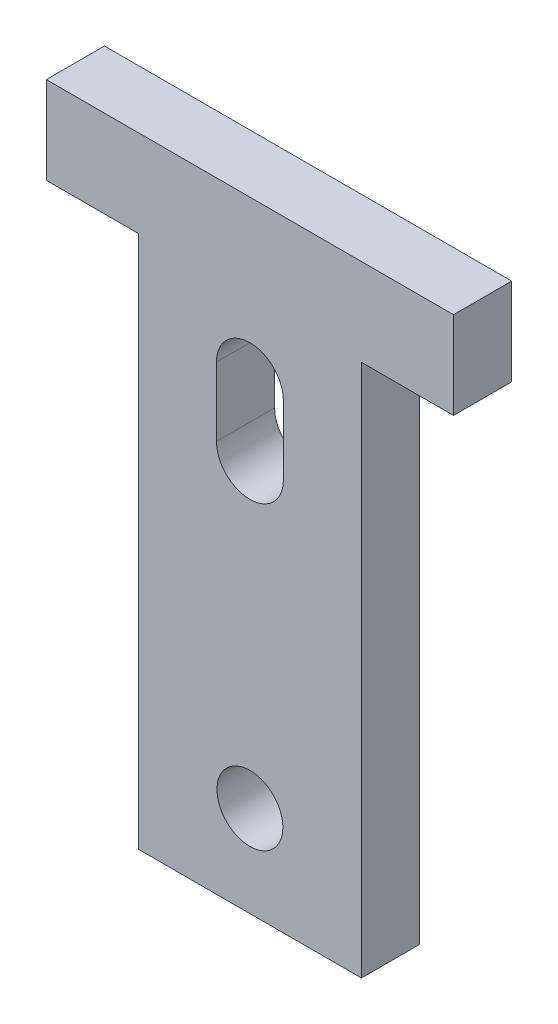
ISO-10303-21;
HEADER;
FILE_DESCRIPTION(('STEP AP214'),'2;1');
FILE_NAME('part.step','',(''),(''),'','','');
FILE_SCHEMA(('AUTOMOTIVE_DESIGN { 1 0 10303 214 1 1 1 1 }'));
ENDSEC;
DATA;
#1=APPLICATION_CONTEXT('core data for automotive mechanical design processes');
#2=APPLICATION_PROTOCOL_DEFINITION('international standard','automotive_design',2000,#1);
#3=PRODUCT_CONTEXT('',#1,'mechanical');
#4=PRODUCT('Part','Part','',(#3));
#5=PRODUCT_RELATED_PRODUCT_CATEGORY('part','',(#4));
#6=PRODUCT_DEFINITION_FORMATION('','',#4);
#7=PRODUCT_DEFINITION_CONTEXT('part definition',#1,'design');
#8=PRODUCT_DEFINITION('design','',#6,#7);
#9=PRODUCT_DEFINITION_SHAPE('','',#8);
#10=(LENGTH_UNIT() NAMED_UNIT(*) SI_UNIT(.MILLI.,.METRE.));
#11=(NAMED_UNIT(*) PLANE_ANGLE_UNIT() SI_UNIT($,.RADIAN.));
#12=(NAMED_UNIT(*) SI_UNIT($,.STERADIAN.) SOLID_ANGLE_UNIT());
#13=UNCERTAINTY_MEASURE_WITH_UNIT(LENGTH_MEASURE(1.E-05),#10,'distance_accuracy_value','');
#14=(GEOMETRIC_REPRESENTATION_CONTEXT(3) GLOBAL_UNCERTAINTY_ASSIGNED_CONTEXT((#13)) GLOBAL_UNIT_ASSIGNED_CONTEXT((#10,
#11,#12)) REPRESENTATION_CONTEXT('',''));
#15=CARTESIAN_POINT('',(0.,0.,0.));
#16=DIRECTION('',(0.,0.,1.));
#17=DIRECTION('',(1.,0.,0.));
#18=AXIS2_PLACEMENT_3D('',#15,#16,#17);
#19=CARTESIAN_POINT('',(-5.75000000000001,16.3534957789841,3.));
#20=DIRECTION('',(1.,0.,0.));
#21=DIRECTION('',(0.,1.,0.));
#22=AXIS2_PLACEMENT_3D('',#19,#20,#21);
#23=PLANE('',#22);
#24=DIRECTION('',(0.,-1.,0.));
#25=VECTOR('',#24,1.);
#26=CARTESIAN_POINT('',(-5.75000000000001,16.3534957789841,0.));
#27=LINE('',#26,#25);
#28=CARTESIAN_POINT('',(-5.75000000000001,16.3534957789841,0.));
#29=VERTEX_POINT('',#28);
#30=CARTESIAN_POINT('',(-5.75,-11.1465042210159,0.));
#31=VERTEX_POINT('',#30);
#32=EDGE_CURVE('E156',#29,#31,#27,.T.);
#33=ORIENTED_EDGE('',*,*,#32,.T.);
#34=DIRECTION('',(0.,0.,-1.));
#35=VECTOR('',#34,1.);
#36=CARTESIAN_POINT('',(-5.75,-11.1465042210159,3.));
#37=LINE('',#36,#35);
#38=CARTESIAN_POINT('',(-5.75,-11.1465042210159,3.));
#39=VERTEX_POINT('',#38);
#40=EDGE_CURVE('E11',#39,#31,#37,.T.);
#41=ORIENTED_EDGE('',*,*,#40,.F.);
#42=DIRECTION('',(0.,-1.,0.));
#43=VECTOR('',#42,1.);
#44=CARTESIAN_POINT('',(-5.75000000000001,16.3534957789841,3.));
#45=LINE('',#44,#43);
#46=CARTESIAN_POINT('',(-5.75000000000001,16.3534957789841,3.));
#47=VERTEX_POINT('',#46);
#48=EDGE_CURVE('E165',#47,#39,#45,.T.);
#49=ORIENTED_EDGE('',*,*,#48,.F.);
#50=DIRECTION('',(0.,0.,-1.));
#51=VECTOR('',#50,1.);
#52=CARTESIAN_POINT('',(-5.75000000000001,16.3534957789841,3.));
#53=LINE('',#52,#51);
#54=EDGE_CURVE('E186',#47,#29,#53,.T.);
#55=ORIENTED_EDGE('',*,*,#54,.T.);
#56=EDGE_LOOP('',(#33,#41,#49,#55));
#57=FACE_BOUND('',#56,.T.);
#58=ADVANCED_FACE('F34',(#57),#23,.F.);
#59=CARTESIAN_POINT('',(-5.75,-11.1465042210159,3.));
#60=DIRECTION('',(0.,1.,0.));
#61=DIRECTION('',(-1.,0.,0.));
#62=AXIS2_PLACEMENT_3D('',#59,#60,#61);
#63=PLANE('',#62);
#64=DIRECTION('',(1.,0.,0.));
#65=VECTOR('',#64,1.);
#66=CARTESIAN_POINT('',(-5.75,-11.1465042210159,0.));
#67=LINE('',#66,#65);
#68=CARTESIAN_POINT('',(5.75,-11.1465042210159,0.));
#69=VERTEX_POINT('',#68);
#70=EDGE_CURVE('E189',#31,#69,#67,.T.);
#71=ORIENTED_EDGE('',*,*,#70,.T.);
#72=DIRECTION('',(0.,0.,-1.));
#73=VECTOR('',#72,1.);
#74=CARTESIAN_POINT('',(5.75,-11.1465042210159,3.));
#75=LINE('',#74,#73);
#76=CARTESIAN_POINT('',(5.75,-11.1465042210159,3.));
#77=VERTEX_POINT('',#76);
#78=EDGE_CURVE('E41',#77,#69,#75,.T.);
#79=ORIENTED_EDGE('',*,*,#78,.F.);
#80=DIRECTION('',(1.,0.,0.));
#81=VECTOR('',#80,1.);
#82=CARTESIAN_POINT('',(-5.75,-11.1465042210159,3.));
#83=LINE('',#82,#81);
#84=EDGE_CURVE('E168',#39,#77,#83,.T.);
#85=ORIENTED_EDGE('',*,*,#84,.F.);
#86=ORIENTED_EDGE('',*,*,#40,.T.);
#87=EDGE_LOOP('',(#71,#79,#85,#86));
#88=FACE_BOUND('',#87,.T.);
#89=ADVANCED_FACE('F225',(#88),#63,.F.);
#90=CARTESIAN_POINT('',(5.75000000000001,16.3534957789841,3.));
#91=DIRECTION('',(1.,0.,0.));
#92=DIRECTION('',(0.,1.,0.));
#93=AXIS2_PLACEMENT_3D('',#90,#91,#92);
#94=PLANE('',#93);
#95=DIRECTION('',(0.,-1.,0.));
#96=VECTOR('',#95,1.);
#97=CARTESIAN_POINT('',(5.75000000000001,16.3534957789841,0.));
#98=LINE('',#97,#96);
#99=CARTESIAN_POINT('',(5.75000000000001,16.3534957789841,0.));
#100=VERTEX_POINT('',#99);
#101=EDGE_CURVE('E192',#100,#69,#98,.T.);
#102=ORIENTED_EDGE('',*,*,#101,.F.);
#103=DIRECTION('',(0.,0.,-1.));
#104=VECTOR('',#103,1.);
#105=CARTESIAN_POINT('',(5.75000000000001,16.3534957789841,3.));
#106=LINE('',#105,#104);
#107=CARTESIAN_POINT('',(5.75000000000001,16.3534957789841,3.));
#108=VERTEX_POINT('',#107);
#109=EDGE_CURVE('E218',#108,#100,#106,.T.);
#110=ORIENTED_EDGE('',*,*,#109,.F.);
#111=DIRECTION('',(0.,-1.,0.));
#112=VECTOR('',#111,1.);
#113=CARTESIAN_POINT('',(5.75000000000001,16.3534957789841,3.));
#114=LINE('',#113,#112);
#115=EDGE_CURVE('E171',#108,#77,#114,.T.);
#116=ORIENTED_EDGE('',*,*,#115,.T.);
#117=ORIENTED_EDGE('',*,*,#78,.T.);
#118=EDGE_LOOP('',(#102,#110,#116,#117));
#119=FACE_BOUND('',#118,.T.);
#120=ADVANCED_FACE('F222',(#119),#94,.T.);
#121=CARTESIAN_POINT('',(10.5,16.3534957789841,3.));
#122=DIRECTION('',(0.,-1.,0.));
#123=DIRECTION('',(0.,0.,-1.));
#124=AXIS2_PLACEMENT_3D('',#121,#122,#123);
#125=PLANE('',#124);
#126=DIRECTION('',(-1.,0.,0.));
#127=VECTOR('',#126,1.);
#128=CARTESIAN_POINT('',(10.5,16.3534957789841,0.));
#129=LINE('',#128,#127);
#130=CARTESIAN_POINT('',(10.5,16.3534957789841,0.));
#131=VERTEX_POINT('',#130);
#132=EDGE_CURVE('E195',#131,#100,#129,.T.);
#133=ORIENTED_EDGE('',*,*,#132,.F.);
#134=DIRECTION('',(0.,0.,-1.));
#135=VECTOR('',#134,1.);
#136=CARTESIAN_POINT('',(10.5,16.3534957789841,3.));
#137=LINE('',#136,#135);
#138=CARTESIAN_POINT('',(10.5,16.3534957789841,3.));
#139=VERTEX_POINT('',#138);
#140=EDGE_CURVE('E216',#139,#131,#137,.T.);
#141=ORIENTED_EDGE('',*,*,#140,.F.);
#142=DIRECTION('',(-1.,0.,0.));
#143=VECTOR('',#142,1.);
#144=CARTESIAN_POINT('',(10.5,16.3534957789841,3.));
#145=LINE('',#144,#143);
#146=EDGE_CURVE('E174',#139,#108,#145,.T.);
#147=ORIENTED_EDGE('',*,*,#146,.T.);
#148=ORIENTED_EDGE('',*,*,#109,.T.);
#149=EDGE_LOOP('',(#133,#141,#147,#148));
#150=FACE_BOUND('',#149,.T.);
#151=ADVANCED_FACE('F233',(#150),#125,.T.);
#152=CARTESIAN_POINT('',(10.5,20.8534957789841,3.));
#153=DIRECTION('',(1.,0.,0.));
#154=DIRECTION('',(0.,1.,0.));
#155=AXIS2_PLACEMENT_3D('',#152,#153,#154);
#156=PLANE('',#155);
#157=DIRECTION('',(0.,-1.,0.));
#158=VECTOR('',#157,1.);
#159=CARTESIAN_POINT('',(10.5,20.8534957789841,0.));
#160=LINE('',#159,#158);
#161=CARTESIAN_POINT('',(10.5,20.8534957789841,0.));
#162=VERTEX_POINT('',#161);
#163=EDGE_CURVE('E198',#162,#131,#160,.T.);
#164=ORIENTED_EDGE('',*,*,#163,.F.);
#165=DIRECTION('',(0.,0.,-1.));
#166=VECTOR('',#165,1.);
#167=CARTESIAN_POINT('',(10.5,20.8534957789841,3.));
#168=LINE('',#167,#166);
#169=CARTESIAN_POINT('',(10.5,20.8534957789841,3.));
#170=VERTEX_POINT('',#169);
#171=EDGE_CURVE('E214',#170,#162,#168,.T.);
#172=ORIENTED_EDGE('',*,*,#171,.F.);
#173=DIRECTION('',(0.,-1.,0.));
#174=VECTOR('',#173,1.);
#175=CARTESIAN_POINT('',(10.5,20.8534957789841,3.));
#176=LINE('',#175,#174);
#177=EDGE_CURVE('E177',#170,#139,#176,.T.);
#178=ORIENTED_EDGE('',*,*,#177,.T.);
#179=ORIENTED_EDGE('',*,*,#140,.T.);
#180=EDGE_LOOP('',(#164,#172,#178,#179));
#181=FACE_BOUND('',#180,.T.);
#182=ADVANCED_FACE('F255',(#181),#156,.T.);
#183=CARTESIAN_POINT('',(10.5,20.8534957789841,3.));
#184=DIRECTION('',(0.,-1.,0.));
#185=DIRECTION('',(1.,0.,0.));
#186=AXIS2_PLACEMENT_3D('',#183,#184,#185);
#187=PLANE('',#186);
#188=DIRECTION('',(-1.,0.,0.));
#189=VECTOR('',#188,1.);
#190=CARTESIAN_POINT('',(10.5,20.8534957789841,0.));
#191=LINE('',#190,#189);
#192=CARTESIAN_POINT('',(-10.5,20.8534957789841,0.));
#193=VERTEX_POINT('',#192);
#194=EDGE_CURVE('E201',#162,#193,#191,.T.);
#195=ORIENTED_EDGE('',*,*,#194,.T.);
#196=DIRECTION('',(0.,0.,-1.));
#197=VECTOR('',#196,1.);
#198=CARTESIAN_POINT('',(-10.5,20.8534957789841,3.));
#199=LINE('',#198,#197);
#200=CARTESIAN_POINT('',(-10.5,20.8534957789841,3.));
#201=VERTEX_POINT('',#200);
#202=EDGE_CURVE('E211',#201,#193,#199,.T.);
#203=ORIENTED_EDGE('',*,*,#202,.F.);
#204=DIRECTION('',(-1.,0.,0.));
#205=VECTOR('',#204,1.);
#206=CARTESIAN_POINT('',(10.5,20.8534957789841,3.));
#207=LINE('',#206,#205);
#208=EDGE_CURVE('E180',#170,#201,#207,.T.);
#209=ORIENTED_EDGE('',*,*,#208,.F.);
#210=ORIENTED_EDGE('',*,*,#171,.T.);
#211=EDGE_LOOP('',(#195,#203,#209,#210));
#212=FACE_BOUND('',#211,.T.);
#213=ADVANCED_FACE('F253',(#212),#187,.F.);
#214=CARTESIAN_POINT('',(-10.5,20.8534957789841,3.));
#215=DIRECTION('',(1.,0.,0.));
#216=DIRECTION('',(0.,0.,-1.));
#217=AXIS2_PLACEMENT_3D('',#214,#215,#216);
#218=PLANE('',#217);
#219=DIRECTION('',(0.,-1.,0.));
#220=VECTOR('',#219,1.);
#221=CARTESIAN_POINT('',(-10.5,20.8534957789841,0.));
#222=LINE('',#221,#220);
#223=CARTESIAN_POINT('',(-10.5,16.3534957789841,0.));
#224=VERTEX_POINT('',#223);
#225=EDGE_CURVE('E203',#193,#224,#222,.T.);
#226=ORIENTED_EDGE('',*,*,#225,.T.);
#227=DIRECTION('',(0.,0.,-1.));
#228=VECTOR('',#227,1.);
#229=CARTESIAN_POINT('',(-10.5,16.3534957789841,3.));
#230=LINE('',#229,#228);
#231=CARTESIAN_POINT('',(-10.5,16.3534957789841,3.));
#232=VERTEX_POINT('',#231);
#233=EDGE_CURVE('E208',#232,#224,#230,.T.);
#234=ORIENTED_EDGE('',*,*,#233,.F.);
#235=DIRECTION('',(0.,-1.,0.));
#236=VECTOR('',#235,1.);
#237=CARTESIAN_POINT('',(-10.5,20.8534957789841,3.));
#238=LINE('',#237,#236);
#239=EDGE_CURVE('E182',#201,#232,#238,.T.);
#240=ORIENTED_EDGE('',*,*,#239,.F.);
#241=ORIENTED_EDGE('',*,*,#202,.T.);
#242=EDGE_LOOP('',(#226,#234,#240,#241));
#243=FACE_BOUND('',#242,.T.);
#244=ADVANCED_FACE('F249',(#243),#218,.F.);
#245=CARTESIAN_POINT('',(-10.5,16.3534957789841,3.));
#246=DIRECTION('',(0.,1.,0.));
#247=DIRECTION('',(0.,0.,1.));
#248=AXIS2_PLACEMENT_3D('',#245,#246,#247);
#249=PLANE('',#248);
#250=DIRECTION('',(1.,0.,0.));
#251=VECTOR('',#250,1.);
#252=CARTESIAN_POINT('',(-10.5,16.3534957789841,0.));
#253=LINE('',#252,#251);
#254=EDGE_CURVE('E169',#224,#29,#253,.T.);
#255=ORIENTED_EDGE('',*,*,#254,.T.);
#256=ORIENTED_EDGE('',*,*,#54,.F.);
#257=DIRECTION('',(1.,0.,0.));
#258=VECTOR('',#257,1.);
#259=CARTESIAN_POINT('',(-10.5,16.3534957789841,3.));
#260=LINE('',#259,#258);
#261=EDGE_CURVE('E184',#232,#47,#260,.T.);
#262=ORIENTED_EDGE('',*,*,#261,.F.);
#263=ORIENTED_EDGE('',*,*,#233,.T.);
#264=EDGE_LOOP('',(#255,#256,#262,#263));
#265=FACE_BOUND('',#264,.T.);
#266=ADVANCED_FACE('F245',(#265),#249,.F.);
#267=CARTESIAN_POINT('',(0.,0.,3.));
#268=DIRECTION('',(0.,0.,1.));
#269=DIRECTION('',(1.,0.,0.));
#270=AXIS2_PLACEMENT_3D('',#267,#268,#269);
#271=PLANE('',#270);
#272=CARTESIAN_POINT('',(0.,12.6281669195551,3.));
#273=DIRECTION('',(0.,0.,1.));
#274=DIRECTION('',(1.,0.,0.));
#275=AXIS2_PLACEMENT_3D('',#272,#273,#274);
#276=CIRCLE('',#275,1.72532885942902);
#277=CARTESIAN_POINT('',(1.72532885942902,12.6281669195551,3.));
#278=VERTEX_POINT('',#277);
#279=CARTESIAN_POINT('',(-1.72532885942902,12.6281669195551,3.));
#280=VERTEX_POINT('',#279);
#281=EDGE_CURVE('E48',#278,#280,#276,.T.);
#282=ORIENTED_EDGE('',*,*,#281,.F.);
#283=DIRECTION('',(0.,1.,0.));
#284=VECTOR('',#283,1.);
#285=CARTESIAN_POINT('',(1.72532885942902,12.6281669195551,3.));
#286=LINE('',#285,#284);
#287=CARTESIAN_POINT('',(1.72532885942902,9.07882463841308,3.));
#288=VERTEX_POINT('',#287);
#289=EDGE_CURVE('E140',#288,#278,#286,.T.);
#290=ORIENTED_EDGE('',*,*,#289,.F.);
#291=CARTESIAN_POINT('',(0.,9.07882463841308,3.));
#292=DIRECTION('',(0.,0.,1.));
#293=DIRECTION('',(1.,0.,0.));
#294=AXIS2_PLACEMENT_3D('',#291,#292,#293);
#295=CIRCLE('',#294,1.72532885942902);
#296=CARTESIAN_POINT('',(-1.72532885942902,9.07882463841308,3.));
#297=VERTEX_POINT('',#296);
#298=EDGE_CURVE('E143',#297,#288,#295,.T.);
#299=ORIENTED_EDGE('',*,*,#298,.F.);
#300=DIRECTION('',(0.,-1.,0.));
#301=VECTOR('',#300,1.);
#302=CARTESIAN_POINT('',(-1.72532885942902,12.6281669195551,3.));
#303=LINE('',#302,#301);
#304=EDGE_CURVE('E149',#280,#297,#303,.T.);
#305=ORIENTED_EDGE('',*,*,#304,.F.);
#306=EDGE_LOOP('',(#282,#290,#299,#305));
#307=FACE_BOUND('',#306,.T.);
#308=CARTESIAN_POINT('',(0.,-6.44650422101592,3.));
#309=DIRECTION('',(0.,0.,1.));
#310=DIRECTION('',(1.,0.,0.));
#311=AXIS2_PLACEMENT_3D('',#308,#309,#310);
#312=CIRCLE('',#311,1.7);
#313=CARTESIAN_POINT('',(1.7,-6.44650422101592,3.));
#314=VERTEX_POINT('',#313);
#315=EDGE_CURVE('E162',#314,#314,#312,.T.);
#316=ORIENTED_EDGE('',*,*,#315,.F.);
#317=EDGE_LOOP('',(#316));
#318=FACE_BOUND('',#317,.T.);
#319=ORIENTED_EDGE('',*,*,#48,.T.);
#320=ORIENTED_EDGE('',*,*,#84,.T.);
#321=ORIENTED_EDGE('',*,*,#115,.F.);
#322=ORIENTED_EDGE('',*,*,#146,.F.);
#323=ORIENTED_EDGE('',*,*,#177,.F.);
#324=ORIENTED_EDGE('',*,*,#208,.T.);
#325=ORIENTED_EDGE('',*,*,#239,.T.);
#326=ORIENTED_EDGE('',*,*,#261,.T.);
#327=EDGE_LOOP('',(#319,#320,#321,#322,#323,#324,#325,#326));
#328=FACE_BOUND('',#327,.T.);
#329=ADVANCED_FACE('F236',(#307,#318,#328),#271,.T.);
#330=CARTESIAN_POINT('',(0.,0.,0.));
#331=DIRECTION('',(0.,0.,1.));
#332=DIRECTION('',(1.,0.,0.));
#333=AXIS2_PLACEMENT_3D('',#330,#331,#332);
#334=PLANE('',#333);
#335=DIRECTION('',(0.,1.,0.));
#336=VECTOR('',#335,1.);
#337=CARTESIAN_POINT('',(1.72532885942902,12.6281669195551,0.));
#338=LINE('',#337,#336);
#339=CARTESIAN_POINT('',(1.72532885942902,9.07882463841308,0.));
#340=VERTEX_POINT('',#339);
#341=CARTESIAN_POINT('',(1.72532885942902,12.6281669195551,0.));
#342=VERTEX_POINT('',#341);
#343=EDGE_CURVE('E130',#340,#342,#338,.T.);
#344=ORIENTED_EDGE('',*,*,#343,.T.);
#345=CARTESIAN_POINT('',(0.,12.6281669195551,0.));
#346=DIRECTION('',(0.,0.,1.));
#347=DIRECTION('',(1.,0.,0.));
#348=AXIS2_PLACEMENT_3D('',#345,#346,#347);
#349=CIRCLE('',#348,1.72532885942902);
#350=CARTESIAN_POINT('',(-1.72532885942902,12.6281669195551,0.));
#351=VERTEX_POINT('',#350);
#352=EDGE_CURVE('E124',#342,#351,#349,.T.);
#353=ORIENTED_EDGE('',*,*,#352,.T.);
#354=DIRECTION('',(0.,-1.,0.));
#355=VECTOR('',#354,1.);
#356=CARTESIAN_POINT('',(-1.72532885942902,12.6281669195551,0.));
#357=LINE('',#356,#355);
#358=CARTESIAN_POINT('',(-1.72532885942902,9.07882463841308,0.));
#359=VERTEX_POINT('',#358);
#360=EDGE_CURVE('E133',#351,#359,#357,.T.);
#361=ORIENTED_EDGE('',*,*,#360,.T.);
#362=CARTESIAN_POINT('',(0.,9.07882463841308,0.));
#363=DIRECTION('',(0.,0.,1.));
#364=DIRECTION('',(1.,0.,0.));
#365=AXIS2_PLACEMENT_3D('',#362,#363,#364);
#366=CIRCLE('',#365,1.72532885942902);
#367=EDGE_CURVE('E56',#359,#340,#366,.T.);
#368=ORIENTED_EDGE('',*,*,#367,.T.);
#369=EDGE_LOOP('',(#344,#353,#361,#368));
#370=FACE_BOUND('',#369,.T.);
#371=CARTESIAN_POINT('',(0.,-6.44650422101592,0.));
#372=DIRECTION('',(0.,0.,1.));
#373=DIRECTION('',(1.,0.,0.));
#374=AXIS2_PLACEMENT_3D('',#371,#372,#373);
#375=CIRCLE('',#374,1.7);
#376=CARTESIAN_POINT('',(1.7,-6.44650422101592,0.));
#377=VERTEX_POINT('',#376);
#378=EDGE_CURVE('E150',#377,#377,#375,.T.);
#379=ORIENTED_EDGE('',*,*,#378,.T.);
#380=EDGE_LOOP('',(#379));
#381=FACE_BOUND('',#380,.T.);
#382=ORIENTED_EDGE('',*,*,#32,.F.);
#383=ORIENTED_EDGE('',*,*,#254,.F.);
#384=ORIENTED_EDGE('',*,*,#225,.F.);
#385=ORIENTED_EDGE('',*,*,#194,.F.);
#386=ORIENTED_EDGE('',*,*,#163,.T.);
#387=ORIENTED_EDGE('',*,*,#132,.T.);
#388=ORIENTED_EDGE('',*,*,#101,.T.);
#389=ORIENTED_EDGE('',*,*,#70,.F.);
#390=EDGE_LOOP('',(#382,#383,#384,#385,#386,#387,#388,#389));
#391=FACE_BOUND('',#390,.T.);
#392=ADVANCED_FACE('F137',(#370,#381,#391),#334,.F.);
#393=CARTESIAN_POINT('',(0.,-6.44650422101592,0.));
#394=DIRECTION('',(0.,0.,1.));
#395=DIRECTION('',(1.,0.,0.));
#396=AXIS2_PLACEMENT_3D('',#393,#394,#395);
#397=CYLINDRICAL_SURFACE('',#396,1.7);
#398=ORIENTED_EDGE('',*,*,#378,.F.);
#399=EDGE_LOOP('',(#398));
#400=FACE_BOUND('',#399,.T.);
#401=ORIENTED_EDGE('',*,*,#315,.T.);
#402=EDGE_LOOP('',(#401));
#403=FACE_BOUND('',#402,.T.);
#404=ADVANCED_FACE('F322',(#400,#403),#397,.F.);
#405=CARTESIAN_POINT('',(0.,12.6281669195551,0.));
#406=DIRECTION('',(0.,0.,1.));
#407=DIRECTION('',(1.,0.,0.));
#408=AXIS2_PLACEMENT_3D('',#405,#406,#407);
#409=CYLINDRICAL_SURFACE('',#408,1.72532885942902);
#410=ORIENTED_EDGE('',*,*,#281,.T.);
#411=DIRECTION('',(0.,0.,1.));
#412=VECTOR('',#411,1.);
#413=CARTESIAN_POINT('',(-1.72532885942902,12.6281669195551,0.));
#414=LINE('',#413,#412);
#415=EDGE_CURVE('E120',#351,#280,#414,.T.);
#416=ORIENTED_EDGE('',*,*,#415,.F.);
#417=ORIENTED_EDGE('',*,*,#352,.F.);
#418=DIRECTION('',(0.,0.,1.));
#419=VECTOR('',#418,1.);
#420=CARTESIAN_POINT('',(1.72532885942902,12.6281669195551,0.));
#421=LINE('',#420,#419);
#422=EDGE_CURVE('E154',#342,#278,#421,.T.);
#423=ORIENTED_EDGE('',*,*,#422,.T.);
#424=EDGE_LOOP('',(#410,#416,#417,#423));
#425=FACE_BOUND('',#424,.T.);
#426=ADVANCED_FACE('F122',(#425),#409,.F.);
#427=CARTESIAN_POINT('',(1.72532885942902,12.6281669195551,0.));
#428=DIRECTION('',(1.,0.,0.));
#429=DIRECTION('',(0.,0.,-1.));
#430=AXIS2_PLACEMENT_3D('',#427,#428,#429);
#431=PLANE('',#430);
#432=ORIENTED_EDGE('',*,*,#289,.T.);
#433=ORIENTED_EDGE('',*,*,#422,.F.);
#434=ORIENTED_EDGE('',*,*,#343,.F.);
#435=DIRECTION('',(0.,0.,1.));
#436=VECTOR('',#435,1.);
#437=CARTESIAN_POINT('',(1.72532885942902,9.07882463841308,0.));
#438=LINE('',#437,#436);
#439=EDGE_CURVE('E157',#340,#288,#438,.T.);
#440=ORIENTED_EDGE('',*,*,#439,.T.);
#441=EDGE_LOOP('',(#432,#433,#434,#440));
#442=FACE_BOUND('',#441,.T.);
#443=ADVANCED_FACE('F340',(#442),#431,.F.);
#444=CARTESIAN_POINT('',(0.,9.07882463841308,0.));
#445=DIRECTION('',(0.,0.,1.));
#446=DIRECTION('',(1.,0.,0.));
#447=AXIS2_PLACEMENT_3D('',#444,#445,#446);
#448=CYLINDRICAL_SURFACE('',#447,1.72532885942902);
#449=ORIENTED_EDGE('',*,*,#298,.T.);
#450=ORIENTED_EDGE('',*,*,#439,.F.);
#451=ORIENTED_EDGE('',*,*,#367,.F.);
#452=DIRECTION('',(0.,0.,1.));
#453=VECTOR('',#452,1.);
#454=CARTESIAN_POINT('',(-1.72532885942902,9.07882463841308,0.));
#455=LINE('',#454,#453);
#456=EDGE_CURVE('E129',#359,#297,#455,.T.);
#457=ORIENTED_EDGE('',*,*,#456,.T.);
#458=EDGE_LOOP('',(#449,#450,#451,#457));
#459=FACE_BOUND('',#458,.T.);
#460=ADVANCED_FACE('F349',(#459),#448,.F.);
#461=CARTESIAN_POINT('',(-1.72532885942902,12.6281669195551,0.));
#462=DIRECTION('',(-1.,0.,0.));
#463=DIRECTION('',(0.,0.,1.));
#464=AXIS2_PLACEMENT_3D('',#461,#462,#463);
#465=PLANE('',#464);
#466=ORIENTED_EDGE('',*,*,#304,.T.);
#467=ORIENTED_EDGE('',*,*,#456,.F.);
#468=ORIENTED_EDGE('',*,*,#360,.F.);
#469=ORIENTED_EDGE('',*,*,#415,.T.);
#470=EDGE_LOOP('',(#466,#467,#468,#469));
#471=FACE_BOUND('',#470,.T.);
#472=ADVANCED_FACE('F134',(#471),#465,.F.);
#473=CLOSED_SHELL('',(#58,#89,#120,#151,#182,#213,#244,#266,#329,#392,#404,#426,#443,#460,#472));
#474=MANIFOLD_SOLID_BREP('B2',#473);
#475=ADVANCED_BREP_SHAPE_REPRESENTATION('',(#18,#474),#14);
#476=SHAPE_DEFINITION_REPRESENTATION(#9,#475);
ENDSEC;
END-ISO-10303-21;
